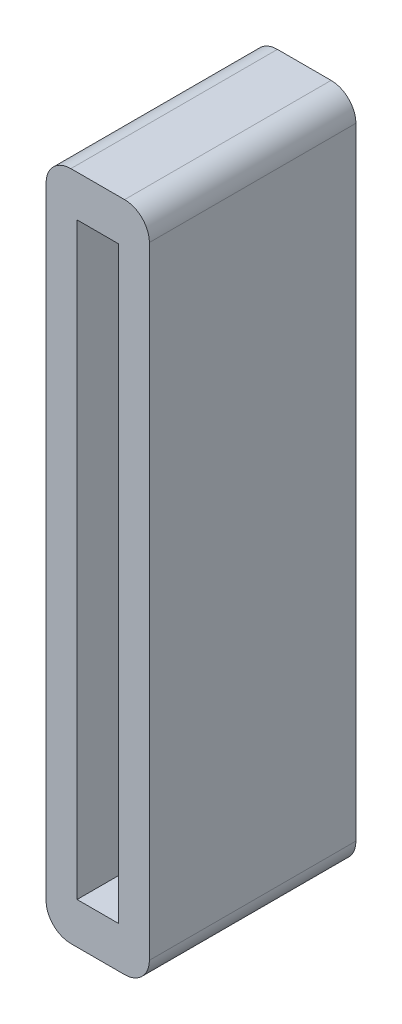
ISO-10303-21;
HEADER;
FILE_DESCRIPTION(('STEP AP214'),'2;1');
FILE_NAME('part.step','',(''),(''),'','','');
FILE_SCHEMA(('AUTOMOTIVE_DESIGN { 1 0 10303 214 1 1 1 1 }'));
ENDSEC;
DATA;
#1=APPLICATION_CONTEXT('core data for automotive mechanical design processes');
#2=APPLICATION_PROTOCOL_DEFINITION('international standard','automotive_design',2000,#1);
#3=PRODUCT_CONTEXT('',#1,'mechanical');
#4=PRODUCT('Part','Part','',(#3));
#5=PRODUCT_RELATED_PRODUCT_CATEGORY('part','',(#4));
#6=PRODUCT_DEFINITION_FORMATION('','',#4);
#7=PRODUCT_DEFINITION_CONTEXT('part definition',#1,'design');
#8=PRODUCT_DEFINITION('design','',#6,#7);
#9=PRODUCT_DEFINITION_SHAPE('','',#8);
#10=(LENGTH_UNIT() NAMED_UNIT(*) SI_UNIT(.MILLI.,.METRE.));
#11=(NAMED_UNIT(*) PLANE_ANGLE_UNIT() SI_UNIT($,.RADIAN.));
#12=(NAMED_UNIT(*) SI_UNIT($,.STERADIAN.) SOLID_ANGLE_UNIT());
#13=UNCERTAINTY_MEASURE_WITH_UNIT(LENGTH_MEASURE(1.E-05),#10,'distance_accuracy_value','');
#14=(GEOMETRIC_REPRESENTATION_CONTEXT(3) GLOBAL_UNCERTAINTY_ASSIGNED_CONTEXT((#13)) GLOBAL_UNIT_ASSIGNED_CONTEXT((#10,
#11,#12)) REPRESENTATION_CONTEXT('',''));
#15=CARTESIAN_POINT('',(0.,0.,0.));
#16=DIRECTION('',(0.,0.,1.));
#17=DIRECTION('',(1.,0.,0.));
#18=AXIS2_PLACEMENT_3D('',#15,#16,#17);
#19=CARTESIAN_POINT('',(2.6,30.1,10.));
#20=DIRECTION('',(0.,0.,1.));
#21=DIRECTION('',(1.,0.,0.));
#22=AXIS2_PLACEMENT_3D('',#19,#20,#21);
#23=PLANE('',#22);
#24=CARTESIAN_POINT('',(2.6,30.1,10.));
#25=DIRECTION('',(0.,0.,1.));
#26=DIRECTION('',(1.,0.,0.));
#27=AXIS2_PLACEMENT_3D('',#24,#25,#26);
#28=CIRCLE('',#27,2.4);
#29=CARTESIAN_POINT('',(5.,30.1,10.));
#30=VERTEX_POINT('',#29);
#31=CARTESIAN_POINT('',(2.6,32.5,10.));
#32=VERTEX_POINT('',#31);
#33=EDGE_CURVE('E178',#30,#32,#28,.T.);
#34=ORIENTED_EDGE('',*,*,#33,.T.);
#35=DIRECTION('',(-1.,0.,0.));
#36=VECTOR('',#35,1.);
#37=CARTESIAN_POINT('',(-2.60000000000001,32.5,10.));
#38=LINE('',#37,#36);
#39=CARTESIAN_POINT('',(-2.60000000000001,32.5,10.));
#40=VERTEX_POINT('',#39);
#41=EDGE_CURVE('E182',#32,#40,#38,.T.);
#42=ORIENTED_EDGE('',*,*,#41,.T.);
#43=CARTESIAN_POINT('',(-2.60000000000001,30.1,10.));
#44=DIRECTION('',(0.,0.,1.));
#45=DIRECTION('',(1.,0.,0.));
#46=AXIS2_PLACEMENT_3D('',#43,#44,#45);
#47=CIRCLE('',#46,2.4);
#48=CARTESIAN_POINT('',(-5.00000000000001,30.1,10.));
#49=VERTEX_POINT('',#48);
#50=EDGE_CURVE('E186',#40,#49,#47,.T.);
#51=ORIENTED_EDGE('',*,*,#50,.T.);
#52=DIRECTION('',(0.,-1.,0.));
#53=VECTOR('',#52,1.);
#54=CARTESIAN_POINT('',(-5.00000000000001,30.1,10.));
#55=LINE('',#54,#53);
#56=CARTESIAN_POINT('',(-5.,-30.1,10.));
#57=VERTEX_POINT('',#56);
#58=EDGE_CURVE('E189',#49,#57,#55,.T.);
#59=ORIENTED_EDGE('',*,*,#58,.T.);
#60=CARTESIAN_POINT('',(-2.6,-30.1,10.));
#61=DIRECTION('',(0.,0.,1.));
#62=DIRECTION('',(1.,0.,0.));
#63=AXIS2_PLACEMENT_3D('',#60,#61,#62);
#64=CIRCLE('',#63,2.4);
#65=CARTESIAN_POINT('',(-2.6,-32.5,10.));
#66=VERTEX_POINT('',#65);
#67=EDGE_CURVE('E192',#57,#66,#64,.T.);
#68=ORIENTED_EDGE('',*,*,#67,.T.);
#69=DIRECTION('',(1.,0.,0.));
#70=VECTOR('',#69,1.);
#71=CARTESIAN_POINT('',(-2.6,-32.5,10.));
#72=LINE('',#71,#70);
#73=CARTESIAN_POINT('',(2.6,-32.5,10.));
#74=VERTEX_POINT('',#73);
#75=EDGE_CURVE('E195',#66,#74,#72,.T.);
#76=ORIENTED_EDGE('',*,*,#75,.T.);
#77=CARTESIAN_POINT('',(2.6,-30.1,10.));
#78=DIRECTION('',(0.,0.,1.));
#79=DIRECTION('',(-1.,0.,0.));
#80=AXIS2_PLACEMENT_3D('',#77,#78,#79);
#81=CIRCLE('',#80,2.4);
#82=CARTESIAN_POINT('',(5.,-30.1,10.));
#83=VERTEX_POINT('',#82);
#84=EDGE_CURVE('E198',#74,#83,#81,.T.);
#85=ORIENTED_EDGE('',*,*,#84,.T.);
#86=DIRECTION('',(0.,1.,0.));
#87=VECTOR('',#86,1.);
#88=CARTESIAN_POINT('',(5.,30.1,10.));
#89=LINE('',#88,#87);
#90=EDGE_CURVE('E201',#83,#30,#89,.T.);
#91=ORIENTED_EDGE('',*,*,#90,.T.);
#92=EDGE_LOOP('',(#34,#42,#51,#59,#68,#76,#85,#91));
#93=FACE_BOUND('',#92,.T.);
#94=DIRECTION('',(-1.,0.,0.));
#95=VECTOR('',#94,1.);
#96=CARTESIAN_POINT('',(-2.,28.5,10.));
#97=LINE('',#96,#95);
#98=CARTESIAN_POINT('',(2.,28.5,10.));
#99=VERTEX_POINT('',#98);
#100=CARTESIAN_POINT('',(-2.,28.5,10.));
#101=VERTEX_POINT('',#100);
#102=EDGE_CURVE('E139',#99,#101,#97,.T.);
#103=ORIENTED_EDGE('',*,*,#102,.F.);
#104=DIRECTION('',(0.,1.,0.));
#105=VECTOR('',#104,1.);
#106=CARTESIAN_POINT('',(2.,28.5,10.));
#107=LINE('',#106,#105);
#108=CARTESIAN_POINT('',(2.,-28.5,10.));
#109=VERTEX_POINT('',#108);
#110=EDGE_CURVE('E130',#109,#99,#107,.T.);
#111=ORIENTED_EDGE('',*,*,#110,.F.);
#112=DIRECTION('',(1.,0.,0.));
#113=VECTOR('',#112,1.);
#114=CARTESIAN_POINT('',(-2.,-28.5,10.));
#115=LINE('',#114,#113);
#116=CARTESIAN_POINT('',(-2.,-28.5,10.));
#117=VERTEX_POINT('',#116);
#118=EDGE_CURVE('E156',#117,#109,#115,.T.);
#119=ORIENTED_EDGE('',*,*,#118,.F.);
#120=DIRECTION('',(0.,-1.,0.));
#121=VECTOR('',#120,1.);
#122=CARTESIAN_POINT('',(-2.,28.5,10.));
#123=LINE('',#122,#121);
#124=EDGE_CURVE('E152',#101,#117,#123,.T.);
#125=ORIENTED_EDGE('',*,*,#124,.F.);
#126=EDGE_LOOP('',(#103,#111,#119,#125));
#127=FACE_BOUND('',#126,.T.);
#128=ADVANCED_FACE('F40',(#93,#127),#23,.T.);
#129=CARTESIAN_POINT('',(2.6,30.1,-10.));
#130=DIRECTION('',(0.,0.,1.));
#131=DIRECTION('',(1.,0.,0.));
#132=AXIS2_PLACEMENT_3D('',#129,#130,#131);
#133=PLANE('',#132);
#134=CARTESIAN_POINT('',(2.6,30.1,-10.));
#135=DIRECTION('',(0.,0.,1.));
#136=DIRECTION('',(1.,0.,0.));
#137=AXIS2_PLACEMENT_3D('',#134,#135,#136);
#138=CIRCLE('',#137,2.4);
#139=CARTESIAN_POINT('',(5.,30.1,-10.));
#140=VERTEX_POINT('',#139);
#141=CARTESIAN_POINT('',(2.6,32.5,-10.));
#142=VERTEX_POINT('',#141);
#143=EDGE_CURVE('E148',#140,#142,#138,.T.);
#144=ORIENTED_EDGE('',*,*,#143,.F.);
#145=DIRECTION('',(0.,1.,0.));
#146=VECTOR('',#145,1.);
#147=CARTESIAN_POINT('',(5.,30.1,-10.));
#148=LINE('',#147,#146);
#149=CARTESIAN_POINT('',(5.,-30.1,-10.));
#150=VERTEX_POINT('',#149);
#151=EDGE_CURVE('E183',#150,#140,#148,.T.);
#152=ORIENTED_EDGE('',*,*,#151,.F.);
#153=CARTESIAN_POINT('',(2.6,-30.1,-10.));
#154=DIRECTION('',(0.,0.,1.));
#155=DIRECTION('',(-1.,0.,0.));
#156=AXIS2_PLACEMENT_3D('',#153,#154,#155);
#157=CIRCLE('',#156,2.4);
#158=CARTESIAN_POINT('',(2.6,-32.5,-10.));
#159=VERTEX_POINT('',#158);
#160=EDGE_CURVE('E223',#159,#150,#157,.T.);
#161=ORIENTED_EDGE('',*,*,#160,.F.);
#162=DIRECTION('',(1.,0.,0.));
#163=VECTOR('',#162,1.);
#164=CARTESIAN_POINT('',(-2.6,-32.5,-10.));
#165=LINE('',#164,#163);
#166=CARTESIAN_POINT('',(-2.6,-32.5,-10.));
#167=VERTEX_POINT('',#166);
#168=EDGE_CURVE('E220',#167,#159,#165,.T.);
#169=ORIENTED_EDGE('',*,*,#168,.F.);
#170=CARTESIAN_POINT('',(-2.6,-30.1,-10.));
#171=DIRECTION('',(0.,0.,1.));
#172=DIRECTION('',(1.,0.,0.));
#173=AXIS2_PLACEMENT_3D('',#170,#171,#172);
#174=CIRCLE('',#173,2.4);
#175=CARTESIAN_POINT('',(-5.,-30.1,-10.));
#176=VERTEX_POINT('',#175);
#177=EDGE_CURVE('E217',#176,#167,#174,.T.);
#178=ORIENTED_EDGE('',*,*,#177,.F.);
#179=DIRECTION('',(0.,-1.,0.));
#180=VECTOR('',#179,1.);
#181=CARTESIAN_POINT('',(-5.00000000000001,30.1,-10.));
#182=LINE('',#181,#180);
#183=CARTESIAN_POINT('',(-5.00000000000001,30.1,-10.));
#184=VERTEX_POINT('',#183);
#185=EDGE_CURVE('E214',#184,#176,#182,.T.);
#186=ORIENTED_EDGE('',*,*,#185,.F.);
#187=CARTESIAN_POINT('',(-2.60000000000001,30.1,-10.));
#188=DIRECTION('',(0.,0.,1.));
#189=DIRECTION('',(1.,0.,0.));
#190=AXIS2_PLACEMENT_3D('',#187,#188,#189);
#191=CIRCLE('',#190,2.4);
#192=CARTESIAN_POINT('',(-2.60000000000001,32.5,-10.));
#193=VERTEX_POINT('',#192);
#194=EDGE_CURVE('E211',#193,#184,#191,.T.);
#195=ORIENTED_EDGE('',*,*,#194,.F.);
#196=DIRECTION('',(-1.,0.,0.));
#197=VECTOR('',#196,1.);
#198=CARTESIAN_POINT('',(-2.60000000000001,32.5,-10.));
#199=LINE('',#198,#197);
#200=EDGE_CURVE('E208',#142,#193,#199,.T.);
#201=ORIENTED_EDGE('',*,*,#200,.F.);
#202=EDGE_LOOP('',(#144,#152,#161,#169,#178,#186,#195,#201));
#203=FACE_BOUND('',#202,.T.);
#204=DIRECTION('',(0.,1.,0.));
#205=VECTOR('',#204,1.);
#206=CARTESIAN_POINT('',(2.,28.5,-10.));
#207=LINE('',#206,#205);
#208=CARTESIAN_POINT('',(2.,-28.5,-10.));
#209=VERTEX_POINT('',#208);
#210=CARTESIAN_POINT('',(2.,28.5,-10.));
#211=VERTEX_POINT('',#210);
#212=EDGE_CURVE('E64',#209,#211,#207,.T.);
#213=ORIENTED_EDGE('',*,*,#212,.T.);
#214=DIRECTION('',(-1.,0.,0.));
#215=VECTOR('',#214,1.);
#216=CARTESIAN_POINT('',(-2.,28.5,-10.));
#217=LINE('',#216,#215);
#218=CARTESIAN_POINT('',(-2.,28.5,-10.));
#219=VERTEX_POINT('',#218);
#220=EDGE_CURVE('E146',#211,#219,#217,.T.);
#221=ORIENTED_EDGE('',*,*,#220,.T.);
#222=DIRECTION('',(0.,-1.,0.));
#223=VECTOR('',#222,1.);
#224=CARTESIAN_POINT('',(-2.,28.5,-10.));
#225=LINE('',#224,#223);
#226=CARTESIAN_POINT('',(-2.,-28.5,-10.));
#227=VERTEX_POINT('',#226);
#228=EDGE_CURVE('E165',#219,#227,#225,.T.);
#229=ORIENTED_EDGE('',*,*,#228,.T.);
#230=DIRECTION('',(1.,0.,0.));
#231=VECTOR('',#230,1.);
#232=CARTESIAN_POINT('',(-2.,-28.5,-10.));
#233=LINE('',#232,#231);
#234=EDGE_CURVE('E140',#227,#209,#233,.T.);
#235=ORIENTED_EDGE('',*,*,#234,.T.);
#236=EDGE_LOOP('',(#213,#221,#229,#235));
#237=FACE_BOUND('',#236,.T.);
#238=ADVANCED_FACE('F262',(#203,#237),#133,.F.);
#239=CARTESIAN_POINT('',(2.6,30.1,10.));
#240=DIRECTION('',(0.,0.,-1.));
#241=DIRECTION('',(-1.,0.,0.));
#242=AXIS2_PLACEMENT_3D('',#239,#240,#241);
#243=CYLINDRICAL_SURFACE('',#242,2.4);
#244=ORIENTED_EDGE('',*,*,#143,.T.);
#245=DIRECTION('',(0.,0.,-1.));
#246=VECTOR('',#245,1.);
#247=CARTESIAN_POINT('',(2.6,32.5,10.));
#248=LINE('',#247,#246);
#249=EDGE_CURVE('E11',#32,#142,#248,.T.);
#250=ORIENTED_EDGE('',*,*,#249,.F.);
#251=ORIENTED_EDGE('',*,*,#33,.F.);
#252=DIRECTION('',(0.,0.,-1.));
#253=VECTOR('',#252,1.);
#254=CARTESIAN_POINT('',(5.,30.1,10.));
#255=LINE('',#254,#253);
#256=EDGE_CURVE('E204',#30,#140,#255,.T.);
#257=ORIENTED_EDGE('',*,*,#256,.T.);
#258=EDGE_LOOP('',(#244,#250,#251,#257));
#259=FACE_BOUND('',#258,.T.);
#260=ADVANCED_FACE('F42',(#259),#243,.T.);
#261=CARTESIAN_POINT('',(-2.60000000000001,32.5,10.));
#262=DIRECTION('',(0.,-1.,0.));
#263=DIRECTION('',(0.,0.,-1.));
#264=AXIS2_PLACEMENT_3D('',#261,#262,#263);
#265=PLANE('',#264);
#266=ORIENTED_EDGE('',*,*,#200,.T.);
#267=DIRECTION('',(0.,0.,-1.));
#268=VECTOR('',#267,1.);
#269=CARTESIAN_POINT('',(-2.60000000000001,32.5,10.));
#270=LINE('',#269,#268);
#271=EDGE_CURVE('E49',#40,#193,#270,.T.);
#272=ORIENTED_EDGE('',*,*,#271,.F.);
#273=ORIENTED_EDGE('',*,*,#41,.F.);
#274=ORIENTED_EDGE('',*,*,#249,.T.);
#275=EDGE_LOOP('',(#266,#272,#273,#274));
#276=FACE_BOUND('',#275,.T.);
#277=ADVANCED_FACE('F279',(#276),#265,.F.);
#278=CARTESIAN_POINT('',(-2.60000000000001,30.1,10.));
#279=DIRECTION('',(0.,0.,-1.));
#280=DIRECTION('',(-1.,0.,0.));
#281=AXIS2_PLACEMENT_3D('',#278,#279,#280);
#282=CYLINDRICAL_SURFACE('',#281,2.4);
#283=ORIENTED_EDGE('',*,*,#194,.T.);
#284=DIRECTION('',(0.,0.,-1.));
#285=VECTOR('',#284,1.);
#286=CARTESIAN_POINT('',(-5.00000000000001,30.1,10.));
#287=LINE('',#286,#285);
#288=EDGE_CURVE('E247',#49,#184,#287,.T.);
#289=ORIENTED_EDGE('',*,*,#288,.F.);
#290=ORIENTED_EDGE('',*,*,#50,.F.);
#291=ORIENTED_EDGE('',*,*,#271,.T.);
#292=EDGE_LOOP('',(#283,#289,#290,#291));
#293=FACE_BOUND('',#292,.T.);
#294=ADVANCED_FACE('F256',(#293),#282,.T.);
#295=CARTESIAN_POINT('',(-5.00000000000001,30.1,10.));
#296=DIRECTION('',(1.,0.,0.));
#297=DIRECTION('',(0.,1.,0.));
#298=AXIS2_PLACEMENT_3D('',#295,#296,#297);
#299=PLANE('',#298);
#300=ORIENTED_EDGE('',*,*,#185,.T.);
#301=DIRECTION('',(0.,0.,-1.));
#302=VECTOR('',#301,1.);
#303=CARTESIAN_POINT('',(-5.,-30.1,10.));
#304=LINE('',#303,#302);
#305=EDGE_CURVE('E243',#57,#176,#304,.T.);
#306=ORIENTED_EDGE('',*,*,#305,.F.);
#307=ORIENTED_EDGE('',*,*,#58,.F.);
#308=ORIENTED_EDGE('',*,*,#288,.T.);
#309=EDGE_LOOP('',(#300,#306,#307,#308));
#310=FACE_BOUND('',#309,.T.);
#311=ADVANCED_FACE('F268',(#310),#299,.F.);
#312=CARTESIAN_POINT('',(-2.6,-30.1,10.));
#313=DIRECTION('',(0.,0.,-1.));
#314=DIRECTION('',(-1.,0.,0.));
#315=AXIS2_PLACEMENT_3D('',#312,#313,#314);
#316=CYLINDRICAL_SURFACE('',#315,2.4);
#317=ORIENTED_EDGE('',*,*,#177,.T.);
#318=DIRECTION('',(0.,0.,-1.));
#319=VECTOR('',#318,1.);
#320=CARTESIAN_POINT('',(-2.6,-32.5,10.));
#321=LINE('',#320,#319);
#322=EDGE_CURVE('E239',#66,#167,#321,.T.);
#323=ORIENTED_EDGE('',*,*,#322,.F.);
#324=ORIENTED_EDGE('',*,*,#67,.F.);
#325=ORIENTED_EDGE('',*,*,#305,.T.);
#326=EDGE_LOOP('',(#317,#323,#324,#325));
#327=FACE_BOUND('',#326,.T.);
#328=ADVANCED_FACE('F272',(#327),#316,.T.);
#329=CARTESIAN_POINT('',(-2.6,-32.5,10.));
#330=DIRECTION('',(0.,1.,0.));
#331=DIRECTION('',(0.,0.,1.));
#332=AXIS2_PLACEMENT_3D('',#329,#330,#331);
#333=PLANE('',#332);
#334=ORIENTED_EDGE('',*,*,#168,.T.);
#335=DIRECTION('',(0.,0.,-1.));
#336=VECTOR('',#335,1.);
#337=CARTESIAN_POINT('',(2.6,-32.5,10.));
#338=LINE('',#337,#336);
#339=EDGE_CURVE('E235',#74,#159,#338,.T.);
#340=ORIENTED_EDGE('',*,*,#339,.F.);
#341=ORIENTED_EDGE('',*,*,#75,.F.);
#342=ORIENTED_EDGE('',*,*,#322,.T.);
#343=EDGE_LOOP('',(#334,#340,#341,#342));
#344=FACE_BOUND('',#343,.T.);
#345=ADVANCED_FACE('F292',(#344),#333,.F.);
#346=CARTESIAN_POINT('',(2.6,-30.1,10.));
#347=DIRECTION('',(0.,0.,-1.));
#348=DIRECTION('',(-1.,0.,0.));
#349=AXIS2_PLACEMENT_3D('',#346,#347,#348);
#350=CYLINDRICAL_SURFACE('',#349,2.4);
#351=ORIENTED_EDGE('',*,*,#160,.T.);
#352=DIRECTION('',(0.,0.,-1.));
#353=VECTOR('',#352,1.);
#354=CARTESIAN_POINT('',(5.,-30.1,10.));
#355=LINE('',#354,#353);
#356=EDGE_CURVE('E231',#83,#150,#355,.T.);
#357=ORIENTED_EDGE('',*,*,#356,.F.);
#358=ORIENTED_EDGE('',*,*,#84,.F.);
#359=ORIENTED_EDGE('',*,*,#339,.T.);
#360=EDGE_LOOP('',(#351,#357,#358,#359));
#361=FACE_BOUND('',#360,.T.);
#362=ADVANCED_FACE('F290',(#361),#350,.T.);
#363=CARTESIAN_POINT('',(5.,30.1,10.));
#364=DIRECTION('',(-1.,0.,0.));
#365=DIRECTION('',(0.,-1.,0.));
#366=AXIS2_PLACEMENT_3D('',#363,#364,#365);
#367=PLANE('',#366);
#368=ORIENTED_EDGE('',*,*,#151,.T.);
#369=ORIENTED_EDGE('',*,*,#256,.F.);
#370=ORIENTED_EDGE('',*,*,#90,.F.);
#371=ORIENTED_EDGE('',*,*,#356,.T.);
#372=EDGE_LOOP('',(#368,#369,#370,#371));
#373=FACE_BOUND('',#372,.T.);
#374=ADVANCED_FACE('F285',(#373),#367,.F.);
#375=CARTESIAN_POINT('',(2.,28.5,10.));
#376=DIRECTION('',(-1.,0.,0.));
#377=DIRECTION('',(0.,-1.,0.));
#378=AXIS2_PLACEMENT_3D('',#375,#376,#377);
#379=PLANE('',#378);
#380=ORIENTED_EDGE('',*,*,#212,.F.);
#381=DIRECTION('',(0.,0.,-1.));
#382=VECTOR('',#381,1.);
#383=CARTESIAN_POINT('',(2.,-28.5,10.));
#384=LINE('',#383,#382);
#385=EDGE_CURVE('E134',#109,#209,#384,.T.);
#386=ORIENTED_EDGE('',*,*,#385,.F.);
#387=ORIENTED_EDGE('',*,*,#110,.T.);
#388=DIRECTION('',(0.,0.,-1.));
#389=VECTOR('',#388,1.);
#390=CARTESIAN_POINT('',(2.,28.5,10.));
#391=LINE('',#390,#389);
#392=EDGE_CURVE('E133',#99,#211,#391,.T.);
#393=ORIENTED_EDGE('',*,*,#392,.T.);
#394=EDGE_LOOP('',(#380,#386,#387,#393));
#395=FACE_BOUND('',#394,.T.);
#396=ADVANCED_FACE('F132',(#395),#379,.T.);
#397=CARTESIAN_POINT('',(-2.,28.5,10.));
#398=DIRECTION('',(0.,-1.,0.));
#399=DIRECTION('',(0.,0.,-1.));
#400=AXIS2_PLACEMENT_3D('',#397,#398,#399);
#401=PLANE('',#400);
#402=ORIENTED_EDGE('',*,*,#220,.F.);
#403=ORIENTED_EDGE('',*,*,#392,.F.);
#404=ORIENTED_EDGE('',*,*,#102,.T.);
#405=DIRECTION('',(0.,0.,-1.));
#406=VECTOR('',#405,1.);
#407=CARTESIAN_POINT('',(-2.,28.5,10.));
#408=LINE('',#407,#406);
#409=EDGE_CURVE('E149',#101,#219,#408,.T.);
#410=ORIENTED_EDGE('',*,*,#409,.T.);
#411=EDGE_LOOP('',(#402,#403,#404,#410));
#412=FACE_BOUND('',#411,.T.);
#413=ADVANCED_FACE('F143',(#412),#401,.T.);
#414=CARTESIAN_POINT('',(-2.,28.5,10.));
#415=DIRECTION('',(1.,0.,0.));
#416=DIRECTION('',(0.,1.,0.));
#417=AXIS2_PLACEMENT_3D('',#414,#415,#416);
#418=PLANE('',#417);
#419=ORIENTED_EDGE('',*,*,#228,.F.);
#420=ORIENTED_EDGE('',*,*,#409,.F.);
#421=ORIENTED_EDGE('',*,*,#124,.T.);
#422=DIRECTION('',(0.,0.,-1.));
#423=VECTOR('',#422,1.);
#424=CARTESIAN_POINT('',(-2.,-28.5,10.));
#425=LINE('',#424,#423);
#426=EDGE_CURVE('E56',#117,#227,#425,.T.);
#427=ORIENTED_EDGE('',*,*,#426,.T.);
#428=EDGE_LOOP('',(#419,#420,#421,#427));
#429=FACE_BOUND('',#428,.T.);
#430=ADVANCED_FACE('F317',(#429),#418,.T.);
#431=CARTESIAN_POINT('',(-2.,-28.5,10.));
#432=DIRECTION('',(0.,1.,0.));
#433=DIRECTION('',(0.,0.,1.));
#434=AXIS2_PLACEMENT_3D('',#431,#432,#433);
#435=PLANE('',#434);
#436=ORIENTED_EDGE('',*,*,#234,.F.);
#437=ORIENTED_EDGE('',*,*,#426,.F.);
#438=ORIENTED_EDGE('',*,*,#118,.T.);
#439=ORIENTED_EDGE('',*,*,#385,.T.);
#440=EDGE_LOOP('',(#436,#437,#438,#439));
#441=FACE_BOUND('',#440,.T.);
#442=ADVANCED_FACE('F321',(#441),#435,.T.);
#443=CLOSED_SHELL('',(#128,#238,#260,#277,#294,#311,#328,#345,#362,#374,#396,#413,#430,#442));
#444=MANIFOLD_SOLID_BREP('B2',#443);
#445=ADVANCED_BREP_SHAPE_REPRESENTATION('',(#18,#444),#14);
#446=SHAPE_DEFINITION_REPRESENTATION(#9,#445);
ENDSEC;
END-ISO-10303-21;
